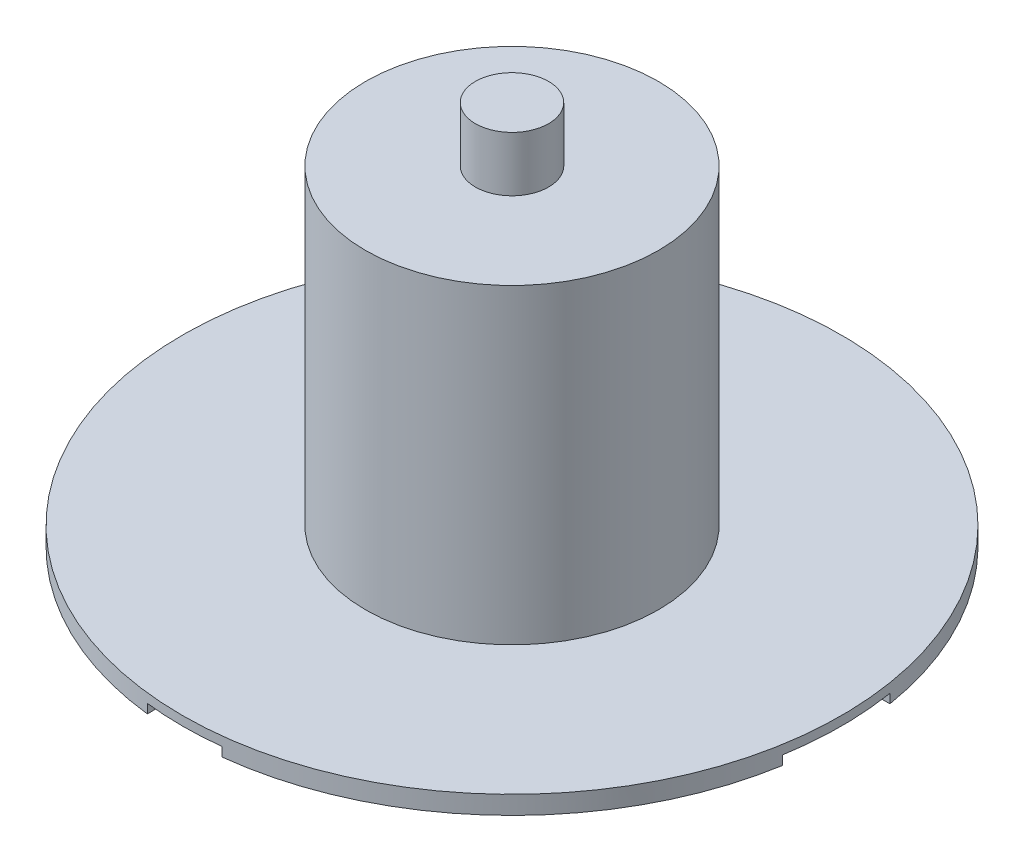
ISO-10303-21;
HEADER;
FILE_DESCRIPTION(('STEP AP214'),'2;1');
FILE_NAME('part.step','',(''),(''),'','','');
FILE_SCHEMA(('AUTOMOTIVE_DESIGN { 1 0 10303 214 1 1 1 1 }'));
ENDSEC;
DATA;
#1=APPLICATION_CONTEXT('core data for automotive mechanical design processes');
#2=APPLICATION_PROTOCOL_DEFINITION('international standard','automotive_design',2000,#1);
#3=PRODUCT_CONTEXT('',#1,'mechanical');
#4=PRODUCT('Part','Part','',(#3));
#5=PRODUCT_RELATED_PRODUCT_CATEGORY('part','',(#4));
#6=PRODUCT_DEFINITION_FORMATION('','',#4);
#7=PRODUCT_DEFINITION_CONTEXT('part definition',#1,'design');
#8=PRODUCT_DEFINITION('design','',#6,#7);
#9=PRODUCT_DEFINITION_SHAPE('','',#8);
#10=(LENGTH_UNIT() NAMED_UNIT(*) SI_UNIT(.MILLI.,.METRE.));
#11=(NAMED_UNIT(*) PLANE_ANGLE_UNIT() SI_UNIT($,.RADIAN.));
#12=(NAMED_UNIT(*) SI_UNIT($,.STERADIAN.) SOLID_ANGLE_UNIT());
#13=UNCERTAINTY_MEASURE_WITH_UNIT(LENGTH_MEASURE(1.E-05),#10,'distance_accuracy_value','');
#14=(GEOMETRIC_REPRESENTATION_CONTEXT(3) GLOBAL_UNCERTAINTY_ASSIGNED_CONTEXT((#13)) GLOBAL_UNIT_ASSIGNED_CONTEXT((#10,
#11,#12)) REPRESENTATION_CONTEXT('',''));
#15=CARTESIAN_POINT('',(0.,0.,0.));
#16=DIRECTION('',(0.,0.,1.));
#17=DIRECTION('',(1.,0.,0.));
#18=AXIS2_PLACEMENT_3D('',#15,#16,#17);
#19=CARTESIAN_POINT('',(0.,1.,0.));
#20=DIRECTION('',(0.,-1.,0.));
#21=DIRECTION('',(0.,0.,-1.));
#22=AXIS2_PLACEMENT_3D('',#19,#20,#21);
#23=CYLINDRICAL_SURFACE('',#22,18.);
#24=CARTESIAN_POINT('',(0.,1.,0.));
#25=DIRECTION('',(0.,1.,0.));
#26=DIRECTION('',(0.,0.,1.));
#27=AXIS2_PLACEMENT_3D('',#24,#25,#26);
#28=CIRCLE('',#27,18.);
#29=CARTESIAN_POINT('',(0.,1.,18.));
#30=VERTEX_POINT('',#29);
#31=EDGE_CURVE('E201',#30,#30,#28,.T.);
#32=ORIENTED_EDGE('',*,*,#31,.F.);
#33=EDGE_LOOP('',(#32));
#34=FACE_BOUND('',#33,.T.);
#35=DIRECTION('',(0.,-1.,0.));
#36=VECTOR('',#35,1.);
#37=CARTESIAN_POINT('',(17.7511123806519,0.5,2.98295310882812));
#38=LINE('',#37,#36);
#39=CARTESIAN_POINT('',(17.7511123806519,0.5,2.98295310882812));
#40=VERTEX_POINT('',#39);
#41=CARTESIAN_POINT('',(17.7511123806519,0.,2.98295310882812));
#42=VERTEX_POINT('',#41);
#43=EDGE_CURVE('E252',#40,#42,#38,.T.);
#44=ORIENTED_EDGE('',*,*,#43,.F.);
#45=CARTESIAN_POINT('',(0.,0.5,0.));
#46=DIRECTION('',(0.,-1.,0.));
#47=DIRECTION('',(0.,0.,-1.));
#48=AXIS2_PLACEMENT_3D('',#45,#46,#47);
#49=CIRCLE('',#48,18.);
#50=CARTESIAN_POINT('',(17.7686827637896,0.5,-2.87644100231601));
#51=VERTEX_POINT('',#50);
#52=EDGE_CURVE('E274',#51,#40,#49,.T.);
#53=ORIENTED_EDGE('',*,*,#52,.F.);
#54=DIRECTION('',(0.,-1.,0.));
#55=VECTOR('',#54,1.);
#56=CARTESIAN_POINT('',(17.7686827637896,0.5,-2.87644100231601));
#57=LINE('',#56,#55);
#58=CARTESIAN_POINT('',(17.7686827637896,0.,-2.87644100231601));
#59=VERTEX_POINT('',#58);
#60=EDGE_CURVE('E254',#51,#59,#57,.T.);
#61=ORIENTED_EDGE('',*,*,#60,.T.);
#62=CARTESIAN_POINT('',(0.,0.,0.));
#63=DIRECTION('',(0.,1.,0.));
#64=DIRECTION('',(0.,0.,1.));
#65=AXIS2_PLACEMENT_3D('',#62,#63,#64);
#66=CIRCLE('',#65,18.);
#67=CARTESIAN_POINT('',(2.035175879397,0.,-17.8845760123051));
#68=VERTEX_POINT('',#67);
#69=EDGE_CURVE('E205',#59,#68,#66,.T.);
#70=ORIENTED_EDGE('',*,*,#69,.T.);
#71=DIRECTION('',(0.,-1.,0.));
#72=VECTOR('',#71,1.);
#73=CARTESIAN_POINT('',(2.035175879397,0.5,-17.8845760123051));
#74=LINE('',#73,#72);
#75=CARTESIAN_POINT('',(2.035175879397,0.5,-17.8845760123051));
#76=VERTEX_POINT('',#75);
#77=EDGE_CURVE('E176',#76,#68,#74,.T.);
#78=ORIENTED_EDGE('',*,*,#77,.F.);
#79=CARTESIAN_POINT('',(0.,0.5,0.));
#80=DIRECTION('',(0.,-1.,0.));
#81=DIRECTION('',(0.,0.,-1.));
#82=AXIS2_PLACEMENT_3D('',#79,#80,#81);
#83=CIRCLE('',#82,18.);
#84=CARTESIAN_POINT('',(-2.03517587939699,0.5,-17.8845760123051));
#85=VERTEX_POINT('',#84);
#86=EDGE_CURVE('E166',#85,#76,#83,.T.);
#87=ORIENTED_EDGE('',*,*,#86,.F.);
#88=DIRECTION('',(0.,-1.,0.));
#89=VECTOR('',#88,1.);
#90=CARTESIAN_POINT('',(-2.03517587939699,0.5,-17.8845760123051));
#91=LINE('',#90,#89);
#92=CARTESIAN_POINT('',(-2.03517587939699,0.,-17.8845760123051));
#93=VERTEX_POINT('',#92);
#94=EDGE_CURVE('E165',#85,#93,#91,.T.);
#95=ORIENTED_EDGE('',*,*,#94,.T.);
#96=CARTESIAN_POINT('',(-17.7686827637896,0.,-2.87644100231601));
#97=VERTEX_POINT('',#96);
#98=EDGE_CURVE('E211',#93,#97,#66,.T.);
#99=ORIENTED_EDGE('',*,*,#98,.T.);
#100=DIRECTION('',(0.,-1.,0.));
#101=VECTOR('',#100,1.);
#102=CARTESIAN_POINT('',(-17.7686827637896,0.5,-2.87644100231601));
#103=LINE('',#102,#101);
#104=CARTESIAN_POINT('',(-17.7686827637896,0.5,-2.87644100231601));
#105=VERTEX_POINT('',#104);
#106=EDGE_CURVE('E220',#105,#97,#103,.T.);
#107=ORIENTED_EDGE('',*,*,#106,.F.);
#108=CARTESIAN_POINT('',(0.,0.5,0.));
#109=DIRECTION('',(0.,-1.,0.));
#110=DIRECTION('',(0.,0.,-1.));
#111=AXIS2_PLACEMENT_3D('',#108,#109,#110);
#112=CIRCLE('',#111,18.);
#113=CARTESIAN_POINT('',(-17.7511123806519,0.5,2.98295310882812));
#114=VERTEX_POINT('',#113);
#115=EDGE_CURVE('E178',#114,#105,#112,.T.);
#116=ORIENTED_EDGE('',*,*,#115,.F.);
#117=DIRECTION('',(0.,-1.,0.));
#118=VECTOR('',#117,1.);
#119=CARTESIAN_POINT('',(-17.7511123806519,0.5,2.98295310882812));
#120=LINE('',#119,#118);
#121=CARTESIAN_POINT('',(-17.7511123806519,0.,2.98295310882812));
#122=VERTEX_POINT('',#121);
#123=EDGE_CURVE('E236',#114,#122,#120,.T.);
#124=ORIENTED_EDGE('',*,*,#123,.T.);
#125=CARTESIAN_POINT('',(-2.035175879397,0.,17.8845760123051));
#126=VERTEX_POINT('',#125);
#127=EDGE_CURVE('E198',#122,#126,#66,.T.);
#128=ORIENTED_EDGE('',*,*,#127,.T.);
#129=DIRECTION('',(0.,-1.,0.));
#130=VECTOR('',#129,1.);
#131=CARTESIAN_POINT('',(-2.035175879397,0.5,17.8845760123051));
#132=LINE('',#131,#130);
#133=CARTESIAN_POINT('',(-2.035175879397,0.5,17.8845760123051));
#134=VERTEX_POINT('',#133);
#135=EDGE_CURVE('E243',#134,#126,#132,.T.);
#136=ORIENTED_EDGE('',*,*,#135,.F.);
#137=CARTESIAN_POINT('',(0.,0.5,0.));
#138=DIRECTION('',(0.,-1.,0.));
#139=DIRECTION('',(0.,0.,-1.));
#140=AXIS2_PLACEMENT_3D('',#137,#138,#139);
#141=CIRCLE('',#140,18.);
#142=CARTESIAN_POINT('',(2.03517587939699,0.5,17.8845760123051));
#143=VERTEX_POINT('',#142);
#144=EDGE_CURVE('E294',#143,#134,#141,.T.);
#145=ORIENTED_EDGE('',*,*,#144,.F.);
#146=DIRECTION('',(0.,-1.,0.));
#147=VECTOR('',#146,1.);
#148=CARTESIAN_POINT('',(2.03517587939699,0.5,17.8845760123051));
#149=LINE('',#148,#147);
#150=CARTESIAN_POINT('',(2.03517587939699,0.,17.8845760123051));
#151=VERTEX_POINT('',#150);
#152=EDGE_CURVE('E245',#143,#151,#149,.T.);
#153=ORIENTED_EDGE('',*,*,#152,.T.);
#154=EDGE_CURVE('E203',#151,#42,#66,.T.);
#155=ORIENTED_EDGE('',*,*,#154,.T.);
#156=EDGE_LOOP('',(#44,#53,#61,#70,#78,#87,#95,#99,#107,#116,#124,#128,#136,#145,#153,#155));
#157=FACE_BOUND('',#156,.T.);
#158=ADVANCED_FACE('F36',(#34,#157),#23,.T.);
#159=CARTESIAN_POINT('',(0.,0.,0.));
#160=DIRECTION('',(0.,1.,0.));
#161=DIRECTION('',(0.,0.,1.));
#162=AXIS2_PLACEMENT_3D('',#159,#160,#161);
#163=PLANE('',#162);
#164=DIRECTION('',(1.,0.,0.));
#165=VECTOR('',#164,1.);
#166=CARTESIAN_POINT('',(0.,0.,2.98295310882812));
#167=LINE('',#166,#165);
#168=CARTESIAN_POINT('',(-4.01272859168579,0.,2.98295310882812));
#169=VERTEX_POINT('',#168);
#170=EDGE_CURVE('E226',#122,#169,#167,.T.);
#171=ORIENTED_EDGE('',*,*,#170,.T.);
#172=CARTESIAN_POINT('',(0.,0.,0.));
#173=DIRECTION('',(0.,-1.,0.));
#174=DIRECTION('',(0.,0.,-1.));
#175=AXIS2_PLACEMENT_3D('',#172,#173,#174);
#176=CIRCLE('',#175,5.);
#177=CARTESIAN_POINT('',(-2.03517587939699,0.,4.56706241909618));
#178=VERTEX_POINT('',#177);
#179=EDGE_CURVE('E316',#178,#169,#176,.T.);
#180=ORIENTED_EDGE('',*,*,#179,.F.);
#181=DIRECTION('',(0.,0.,-1.));
#182=VECTOR('',#181,1.);
#183=CARTESIAN_POINT('',(-2.03517587939699,0.,0.));
#184=LINE('',#183,#182);
#185=EDGE_CURVE('E229',#126,#178,#184,.T.);
#186=ORIENTED_EDGE('',*,*,#185,.F.);
#187=ORIENTED_EDGE('',*,*,#127,.F.);
#188=EDGE_LOOP('',(#171,#180,#186,#187));
#189=FACE_BOUND('',#188,.T.);
#190=ADVANCED_FACE('F318',(#189),#163,.F.);
#191=DIRECTION('',(0.,0.,-1.));
#192=VECTOR('',#191,1.);
#193=CARTESIAN_POINT('',(2.03517587939699,0.,0.));
#194=LINE('',#193,#192);
#195=CARTESIAN_POINT('',(2.03517587939699,0.,4.56706241909618));
#196=VERTEX_POINT('',#195);
#197=EDGE_CURVE('E306',#151,#196,#194,.T.);
#198=ORIENTED_EDGE('',*,*,#197,.T.);
#199=CARTESIAN_POINT('',(4.01272859168579,0.,2.98295310882812));
#200=VERTEX_POINT('',#199);
#201=EDGE_CURVE('E189',#200,#196,#176,.T.);
#202=ORIENTED_EDGE('',*,*,#201,.F.);
#203=DIRECTION('',(1.,0.,0.));
#204=VECTOR('',#203,1.);
#205=CARTESIAN_POINT('',(0.,0.,2.98295310882812));
#206=LINE('',#205,#204);
#207=EDGE_CURVE('E303',#200,#42,#206,.T.);
#208=ORIENTED_EDGE('',*,*,#207,.T.);
#209=ORIENTED_EDGE('',*,*,#154,.F.);
#210=EDGE_LOOP('',(#198,#202,#208,#209));
#211=FACE_BOUND('',#210,.T.);
#212=ADVANCED_FACE('F323',(#211),#163,.F.);
#213=CARTESIAN_POINT('',(-4.08975392416161,0.,-2.87644100231601));
#214=VERTEX_POINT('',#213);
#215=CARTESIAN_POINT('',(-2.03517587939699,0.,-4.56706241909618));
#216=VERTEX_POINT('',#215);
#217=EDGE_CURVE('E174',#214,#216,#176,.T.);
#218=ORIENTED_EDGE('',*,*,#217,.F.);
#219=DIRECTION('',(1.,0.,0.));
#220=VECTOR('',#219,1.);
#221=CARTESIAN_POINT('',(0.,0.,-2.87644100231601));
#222=LINE('',#221,#220);
#223=EDGE_CURVE('E167',#97,#214,#222,.T.);
#224=ORIENTED_EDGE('',*,*,#223,.F.);
#225=ORIENTED_EDGE('',*,*,#98,.F.);
#226=DIRECTION('',(0.,0.,-1.));
#227=VECTOR('',#226,1.);
#228=CARTESIAN_POINT('',(-2.03517587939699,0.,0.));
#229=LINE('',#228,#227);
#230=EDGE_CURVE('E224',#216,#93,#229,.T.);
#231=ORIENTED_EDGE('',*,*,#230,.F.);
#232=EDGE_LOOP('',(#218,#224,#225,#231));
#233=FACE_BOUND('',#232,.T.);
#234=ADVANCED_FACE('F223',(#233),#163,.F.);
#235=ORIENTED_EDGE('',*,*,#69,.F.);
#236=DIRECTION('',(1.,0.,0.));
#237=VECTOR('',#236,1.);
#238=CARTESIAN_POINT('',(0.,0.,-2.87644100231601));
#239=LINE('',#238,#237);
#240=CARTESIAN_POINT('',(4.08975392416161,0.,-2.87644100231601));
#241=VERTEX_POINT('',#240);
#242=EDGE_CURVE('E270',#241,#59,#239,.T.);
#243=ORIENTED_EDGE('',*,*,#242,.F.);
#244=CARTESIAN_POINT('',(2.03517587939699,0.,-4.56706241909618));
#245=VERTEX_POINT('',#244);
#246=EDGE_CURVE('E186',#245,#241,#176,.T.);
#247=ORIENTED_EDGE('',*,*,#246,.F.);
#248=DIRECTION('',(0.,0.,-1.));
#249=VECTOR('',#248,1.);
#250=CARTESIAN_POINT('',(2.03517587939699,0.,0.));
#251=LINE('',#250,#249);
#252=EDGE_CURVE('E264',#245,#68,#251,.T.);
#253=ORIENTED_EDGE('',*,*,#252,.T.);
#254=EDGE_LOOP('',(#235,#243,#247,#253));
#255=FACE_BOUND('',#254,.T.);
#256=ADVANCED_FACE('F268',(#255),#163,.F.);
#257=CARTESIAN_POINT('',(0.,1.,0.));
#258=DIRECTION('',(0.,1.,0.));
#259=DIRECTION('',(0.,0.,1.));
#260=AXIS2_PLACEMENT_3D('',#257,#258,#259);
#261=PLANE('',#260);
#262=CARTESIAN_POINT('',(0.,1.,0.));
#263=DIRECTION('',(0.,1.,0.));
#264=DIRECTION('',(0.,0.,1.));
#265=AXIS2_PLACEMENT_3D('',#262,#263,#264);
#266=CIRCLE('',#265,8.);
#267=CARTESIAN_POINT('',(0.,1.,8.));
#268=VERTEX_POINT('',#267);
#269=EDGE_CURVE('E195',#268,#268,#266,.T.);
#270=ORIENTED_EDGE('',*,*,#269,.F.);
#271=EDGE_LOOP('',(#270));
#272=FACE_BOUND('',#271,.T.);
#273=ORIENTED_EDGE('',*,*,#31,.T.);
#274=EDGE_LOOP('',(#273));
#275=FACE_BOUND('',#274,.T.);
#276=ADVANCED_FACE('F351',(#272,#275),#261,.T.);
#277=CARTESIAN_POINT('',(0.,18.,0.));
#278=DIRECTION('',(0.,-1.,0.));
#279=DIRECTION('',(0.,0.,-1.));
#280=AXIS2_PLACEMENT_3D('',#277,#278,#279);
#281=CYLINDRICAL_SURFACE('',#280,8.);
#282=CARTESIAN_POINT('',(0.,18.,0.));
#283=DIRECTION('',(0.,1.,0.));
#284=DIRECTION('',(0.,0.,1.));
#285=AXIS2_PLACEMENT_3D('',#282,#283,#284);
#286=CIRCLE('',#285,8.);
#287=CARTESIAN_POINT('',(0.,18.,8.));
#288=VERTEX_POINT('',#287);
#289=EDGE_CURVE('E192',#288,#288,#286,.T.);
#290=ORIENTED_EDGE('',*,*,#289,.F.);
#291=EDGE_LOOP('',(#290));
#292=FACE_BOUND('',#291,.T.);
#293=ORIENTED_EDGE('',*,*,#269,.T.);
#294=EDGE_LOOP('',(#293));
#295=FACE_BOUND('',#294,.T.);
#296=ADVANCED_FACE('F353',(#292,#295),#281,.T.);
#297=CARTESIAN_POINT('',(0.,18.,0.));
#298=DIRECTION('',(0.,1.,0.));
#299=DIRECTION('',(0.,0.,1.));
#300=AXIS2_PLACEMENT_3D('',#297,#298,#299);
#301=PLANE('',#300);
#302=CARTESIAN_POINT('',(0.,18.,0.));
#303=DIRECTION('',(0.,1.,0.));
#304=DIRECTION('',(0.,0.,1.));
#305=AXIS2_PLACEMENT_3D('',#302,#303,#304);
#306=CIRCLE('',#305,2.);
#307=CARTESIAN_POINT('',(0.,18.,2.));
#308=VERTEX_POINT('',#307);
#309=EDGE_CURVE('E159',#308,#308,#306,.T.);
#310=ORIENTED_EDGE('',*,*,#309,.F.);
#311=EDGE_LOOP('',(#310));
#312=FACE_BOUND('',#311,.T.);
#313=ORIENTED_EDGE('',*,*,#289,.T.);
#314=EDGE_LOOP('',(#313));
#315=FACE_BOUND('',#314,.T.);
#316=ADVANCED_FACE('F360',(#312,#315),#301,.T.);
#317=CARTESIAN_POINT('',(0.,21.,0.));
#318=DIRECTION('',(0.,-1.,0.));
#319=DIRECTION('',(0.,0.,-1.));
#320=AXIS2_PLACEMENT_3D('',#317,#318,#319);
#321=CYLINDRICAL_SURFACE('',#320,2.);
#322=CARTESIAN_POINT('',(0.,21.,0.));
#323=DIRECTION('',(0.,1.,0.));
#324=DIRECTION('',(0.,0.,1.));
#325=AXIS2_PLACEMENT_3D('',#322,#323,#324);
#326=CIRCLE('',#325,2.);
#327=CARTESIAN_POINT('',(0.,21.,2.));
#328=VERTEX_POINT('',#327);
#329=EDGE_CURVE('E185',#328,#328,#326,.T.);
#330=ORIENTED_EDGE('',*,*,#329,.F.);
#331=EDGE_LOOP('',(#330));
#332=FACE_BOUND('',#331,.T.);
#333=ORIENTED_EDGE('',*,*,#309,.T.);
#334=EDGE_LOOP('',(#333));
#335=FACE_BOUND('',#334,.T.);
#336=ADVANCED_FACE('F367',(#332,#335),#321,.T.);
#337=CARTESIAN_POINT('',(0.,21.,0.));
#338=DIRECTION('',(0.,1.,0.));
#339=DIRECTION('',(0.,0.,1.));
#340=AXIS2_PLACEMENT_3D('',#337,#338,#339);
#341=PLANE('',#340);
#342=ORIENTED_EDGE('',*,*,#329,.T.);
#343=EDGE_LOOP('',(#342));
#344=FACE_BOUND('',#343,.T.);
#345=ADVANCED_FACE('F371',(#344),#341,.T.);
#346=CARTESIAN_POINT('',(0.,8.,0.));
#347=DIRECTION('',(0.,-1.,0.));
#348=DIRECTION('',(0.,0.,-1.));
#349=AXIS2_PLACEMENT_3D('',#346,#347,#348);
#350=CYLINDRICAL_SURFACE('',#349,5.);
#351=DIRECTION('',(0.,-1.,0.));
#352=VECTOR('',#351,1.);
#353=CARTESIAN_POINT('',(-2.03517587939699,0.5,-4.56706241909618));
#354=LINE('',#353,#352);
#355=CARTESIAN_POINT('',(-2.03517587939699,0.5,-4.56706241909618));
#356=VERTEX_POINT('',#355);
#357=EDGE_CURVE('E162',#356,#216,#354,.T.);
#358=ORIENTED_EDGE('',*,*,#357,.F.);
#359=CARTESIAN_POINT('',(0.,0.5,0.));
#360=DIRECTION('',(0.,-1.,0.));
#361=DIRECTION('',(0.,0.,-1.));
#362=AXIS2_PLACEMENT_3D('',#359,#360,#361);
#363=CIRCLE('',#362,5.);
#364=CARTESIAN_POINT('',(2.03517587939699,0.5,-4.56706241909618));
#365=VERTEX_POINT('',#364);
#366=EDGE_CURVE('E39',#365,#356,#363,.F.);
#367=ORIENTED_EDGE('',*,*,#366,.F.);
#368=DIRECTION('',(0.,-1.,0.));
#369=VECTOR('',#368,1.);
#370=CARTESIAN_POINT('',(2.03517587939699,0.5,-4.56706241909618));
#371=LINE('',#370,#369);
#372=EDGE_CURVE('E259',#365,#245,#371,.T.);
#373=ORIENTED_EDGE('',*,*,#372,.T.);
#374=ORIENTED_EDGE('',*,*,#246,.T.);
#375=DIRECTION('',(0.,-1.,0.));
#376=VECTOR('',#375,1.);
#377=CARTESIAN_POINT('',(4.08975392416161,0.5,-2.87644100231601));
#378=LINE('',#377,#376);
#379=CARTESIAN_POINT('',(4.08975392416161,0.5,-2.87644100231601));
#380=VERTEX_POINT('',#379);
#381=EDGE_CURVE('E257',#380,#241,#378,.T.);
#382=ORIENTED_EDGE('',*,*,#381,.F.);
#383=CARTESIAN_POINT('',(4.01272859168579,0.5,2.98295310882812));
#384=VERTEX_POINT('',#383);
#385=EDGE_CURVE('E158',#384,#380,#363,.F.);
#386=ORIENTED_EDGE('',*,*,#385,.F.);
#387=DIRECTION('',(0.,-1.,0.));
#388=VECTOR('',#387,1.);
#389=CARTESIAN_POINT('',(4.01272859168579,0.5,2.98295310882812));
#390=LINE('',#389,#388);
#391=EDGE_CURVE('E249',#384,#200,#390,.T.);
#392=ORIENTED_EDGE('',*,*,#391,.T.);
#393=ORIENTED_EDGE('',*,*,#201,.T.);
#394=DIRECTION('',(0.,-1.,0.));
#395=VECTOR('',#394,1.);
#396=CARTESIAN_POINT('',(2.03517587939699,0.5,4.56706241909618));
#397=LINE('',#396,#395);
#398=CARTESIAN_POINT('',(2.03517587939699,0.5,4.56706241909618));
#399=VERTEX_POINT('',#398);
#400=EDGE_CURVE('E247',#399,#196,#397,.T.);
#401=ORIENTED_EDGE('',*,*,#400,.F.);
#402=CARTESIAN_POINT('',(-2.03517587939699,0.5,4.56706241909618));
#403=VERTEX_POINT('',#402);
#404=EDGE_CURVE('E44',#403,#399,#363,.F.);
#405=ORIENTED_EDGE('',*,*,#404,.F.);
#406=DIRECTION('',(0.,-1.,0.));
#407=VECTOR('',#406,1.);
#408=CARTESIAN_POINT('',(-2.03517587939699,0.5,4.56706241909618));
#409=LINE('',#408,#407);
#410=EDGE_CURVE('E240',#403,#178,#409,.T.);
#411=ORIENTED_EDGE('',*,*,#410,.T.);
#412=ORIENTED_EDGE('',*,*,#179,.T.);
#413=DIRECTION('',(0.,-1.,0.));
#414=VECTOR('',#413,1.);
#415=CARTESIAN_POINT('',(-4.01272859168579,0.5,2.98295310882812));
#416=LINE('',#415,#414);
#417=CARTESIAN_POINT('',(-4.01272859168579,0.5,2.98295310882812));
#418=VERTEX_POINT('',#417);
#419=EDGE_CURVE('E238',#418,#169,#416,.T.);
#420=ORIENTED_EDGE('',*,*,#419,.F.);
#421=CARTESIAN_POINT('',(-4.08975392416161,0.5,-2.87644100231601));
#422=VERTEX_POINT('',#421);
#423=EDGE_CURVE('E11',#422,#418,#363,.F.);
#424=ORIENTED_EDGE('',*,*,#423,.F.);
#425=DIRECTION('',(0.,-1.,0.));
#426=VECTOR('',#425,1.);
#427=CARTESIAN_POINT('',(-4.08975392416161,0.5,-2.87644100231601));
#428=LINE('',#427,#426);
#429=EDGE_CURVE('E233',#422,#214,#428,.T.);
#430=ORIENTED_EDGE('',*,*,#429,.T.);
#431=ORIENTED_EDGE('',*,*,#217,.T.);
#432=EDGE_LOOP('',(#358,#367,#373,#374,#382,#386,#392,#393,#401,#405,#411,#412,#420,#424,#430,#431));
#433=FACE_BOUND('',#432,.T.);
#434=CARTESIAN_POINT('',(0.,8.,0.));
#435=DIRECTION('',(0.,-1.,0.));
#436=DIRECTION('',(0.,0.,-1.));
#437=AXIS2_PLACEMENT_3D('',#434,#435,#436);
#438=CIRCLE('',#437,5.);
#439=CARTESIAN_POINT('',(0.,8.,-5.));
#440=VERTEX_POINT('',#439);
#441=EDGE_CURVE('E182',#440,#440,#438,.T.);
#442=ORIENTED_EDGE('',*,*,#441,.F.);
#443=EDGE_LOOP('',(#442));
#444=FACE_BOUND('',#443,.T.);
#445=ADVANCED_FACE('F170',(#433,#444),#350,.F.);
#446=CARTESIAN_POINT('',(0.,8.,0.));
#447=DIRECTION('',(0.,-1.,0.));
#448=DIRECTION('',(0.,0.,-1.));
#449=AXIS2_PLACEMENT_3D('',#446,#447,#448);
#450=PLANE('',#449);
#451=ORIENTED_EDGE('',*,*,#441,.T.);
#452=EDGE_LOOP('',(#451));
#453=FACE_BOUND('',#452,.T.);
#454=ADVANCED_FACE('F378',(#453),#450,.T.);
#455=CARTESIAN_POINT('',(0.,0.5,0.));
#456=DIRECTION('',(0.,-1.,0.));
#457=DIRECTION('',(0.,0.,-1.));
#458=AXIS2_PLACEMENT_3D('',#455,#456,#457);
#459=PLANE('',#458);
#460=ORIENTED_EDGE('',*,*,#366,.T.);
#461=DIRECTION('',(0.,0.,-1.));
#462=VECTOR('',#461,1.);
#463=CARTESIAN_POINT('',(-2.03517587939699,0.5,0.));
#464=LINE('',#463,#462);
#465=EDGE_CURVE('E151',#356,#85,#464,.T.);
#466=ORIENTED_EDGE('',*,*,#465,.T.);
#467=ORIENTED_EDGE('',*,*,#86,.T.);
#468=DIRECTION('',(0.,0.,-1.));
#469=VECTOR('',#468,1.);
#470=CARTESIAN_POINT('',(2.03517587939699,0.5,0.));
#471=LINE('',#470,#469);
#472=EDGE_CURVE('E153',#365,#76,#471,.T.);
#473=ORIENTED_EDGE('',*,*,#472,.F.);
#474=EDGE_LOOP('',(#460,#466,#467,#473));
#475=FACE_BOUND('',#474,.T.);
#476=ADVANCED_FACE('F149',(#475),#459,.T.);
#477=CARTESIAN_POINT('',(-2.03517587939699,0.5,0.));
#478=DIRECTION('',(-1.,0.,0.));
#479=DIRECTION('',(0.,0.,1.));
#480=AXIS2_PLACEMENT_3D('',#477,#478,#479);
#481=PLANE('',#480);
#482=ORIENTED_EDGE('',*,*,#230,.T.);
#483=ORIENTED_EDGE('',*,*,#94,.F.);
#484=ORIENTED_EDGE('',*,*,#465,.F.);
#485=ORIENTED_EDGE('',*,*,#357,.T.);
#486=EDGE_LOOP('',(#482,#483,#484,#485));
#487=FACE_BOUND('',#486,.T.);
#488=ADVANCED_FACE('F161',(#487),#481,.F.);
#489=CARTESIAN_POINT('',(2.03517587939699,0.5,0.));
#490=DIRECTION('',(-1.,0.,0.));
#491=DIRECTION('',(0.,0.,1.));
#492=AXIS2_PLACEMENT_3D('',#489,#490,#491);
#493=PLANE('',#492);
#494=ORIENTED_EDGE('',*,*,#252,.F.);
#495=ORIENTED_EDGE('',*,*,#372,.F.);
#496=ORIENTED_EDGE('',*,*,#472,.T.);
#497=ORIENTED_EDGE('',*,*,#77,.T.);
#498=EDGE_LOOP('',(#494,#495,#496,#497));
#499=FACE_BOUND('',#498,.T.);
#500=ADVANCED_FACE('F263',(#499),#493,.T.);
#501=ORIENTED_EDGE('',*,*,#385,.T.);
#502=DIRECTION('',(1.,0.,0.));
#503=VECTOR('',#502,1.);
#504=CARTESIAN_POINT('',(0.,0.5,-2.87644100231601));
#505=LINE('',#504,#503);
#506=EDGE_CURVE('E279',#380,#51,#505,.T.);
#507=ORIENTED_EDGE('',*,*,#506,.T.);
#508=ORIENTED_EDGE('',*,*,#52,.T.);
#509=DIRECTION('',(1.,0.,0.));
#510=VECTOR('',#509,1.);
#511=CARTESIAN_POINT('',(0.,0.5,2.98295310882812));
#512=LINE('',#511,#510);
#513=EDGE_CURVE('E285',#384,#40,#512,.T.);
#514=ORIENTED_EDGE('',*,*,#513,.F.);
#515=EDGE_LOOP('',(#501,#507,#508,#514));
#516=FACE_BOUND('',#515,.T.);
#517=ADVANCED_FACE('F282',(#516),#459,.T.);
#518=CARTESIAN_POINT('',(0.,0.5,-2.87644100231601));
#519=DIRECTION('',(0.,0.,-1.));
#520=DIRECTION('',(-1.,0.,0.));
#521=AXIS2_PLACEMENT_3D('',#518,#519,#520);
#522=PLANE('',#521);
#523=ORIENTED_EDGE('',*,*,#242,.T.);
#524=ORIENTED_EDGE('',*,*,#60,.F.);
#525=ORIENTED_EDGE('',*,*,#506,.F.);
#526=ORIENTED_EDGE('',*,*,#381,.T.);
#527=EDGE_LOOP('',(#523,#524,#525,#526));
#528=FACE_BOUND('',#527,.T.);
#529=ADVANCED_FACE('F278',(#528),#522,.F.);
#530=CARTESIAN_POINT('',(0.,0.5,2.98295310882812));
#531=DIRECTION('',(0.,0.,-1.));
#532=DIRECTION('',(-1.,0.,0.));
#533=AXIS2_PLACEMENT_3D('',#530,#531,#532);
#534=PLANE('',#533);
#535=ORIENTED_EDGE('',*,*,#207,.F.);
#536=ORIENTED_EDGE('',*,*,#391,.F.);
#537=ORIENTED_EDGE('',*,*,#513,.T.);
#538=ORIENTED_EDGE('',*,*,#43,.T.);
#539=EDGE_LOOP('',(#535,#536,#537,#538));
#540=FACE_BOUND('',#539,.T.);
#541=ADVANCED_FACE('F330',(#540),#534,.T.);
#542=ORIENTED_EDGE('',*,*,#404,.T.);
#543=DIRECTION('',(0.,0.,-1.));
#544=VECTOR('',#543,1.);
#545=CARTESIAN_POINT('',(2.03517587939699,0.5,0.));
#546=LINE('',#545,#544);
#547=EDGE_CURVE('E291',#143,#399,#546,.T.);
#548=ORIENTED_EDGE('',*,*,#547,.F.);
#549=ORIENTED_EDGE('',*,*,#144,.T.);
#550=DIRECTION('',(0.,0.,-1.));
#551=VECTOR('',#550,1.);
#552=CARTESIAN_POINT('',(-2.03517587939699,0.5,0.));
#553=LINE('',#552,#551);
#554=EDGE_CURVE('E58',#134,#403,#553,.T.);
#555=ORIENTED_EDGE('',*,*,#554,.T.);
#556=EDGE_LOOP('',(#542,#548,#549,#555));
#557=FACE_BOUND('',#556,.T.);
#558=ADVANCED_FACE('F328',(#557),#459,.T.);
#559=CARTESIAN_POINT('',(2.03517587939699,0.5,0.));
#560=DIRECTION('',(-1.,0.,0.));
#561=DIRECTION('',(0.,0.,1.));
#562=AXIS2_PLACEMENT_3D('',#559,#560,#561);
#563=PLANE('',#562);
#564=ORIENTED_EDGE('',*,*,#197,.F.);
#565=ORIENTED_EDGE('',*,*,#152,.F.);
#566=ORIENTED_EDGE('',*,*,#547,.T.);
#567=ORIENTED_EDGE('',*,*,#400,.T.);
#568=EDGE_LOOP('',(#564,#565,#566,#567));
#569=FACE_BOUND('',#568,.T.);
#570=ADVANCED_FACE('F325',(#569),#563,.T.);
#571=CARTESIAN_POINT('',(-2.03517587939699,0.5,0.));
#572=DIRECTION('',(-1.,0.,0.));
#573=DIRECTION('',(0.,0.,1.));
#574=AXIS2_PLACEMENT_3D('',#571,#572,#573);
#575=PLANE('',#574);
#576=ORIENTED_EDGE('',*,*,#185,.T.);
#577=ORIENTED_EDGE('',*,*,#410,.F.);
#578=ORIENTED_EDGE('',*,*,#554,.F.);
#579=ORIENTED_EDGE('',*,*,#135,.T.);
#580=EDGE_LOOP('',(#576,#577,#578,#579));
#581=FACE_BOUND('',#580,.T.);
#582=ADVANCED_FACE('F310',(#581),#575,.F.);
#583=ORIENTED_EDGE('',*,*,#423,.T.);
#584=DIRECTION('',(1.,0.,0.));
#585=VECTOR('',#584,1.);
#586=CARTESIAN_POINT('',(0.,0.5,2.98295310882812));
#587=LINE('',#586,#585);
#588=EDGE_CURVE('E297',#114,#418,#587,.T.);
#589=ORIENTED_EDGE('',*,*,#588,.F.);
#590=ORIENTED_EDGE('',*,*,#115,.T.);
#591=DIRECTION('',(1.,0.,0.));
#592=VECTOR('',#591,1.);
#593=CARTESIAN_POINT('',(0.,0.5,-2.87644100231601));
#594=LINE('',#593,#592);
#595=EDGE_CURVE('E50',#105,#422,#594,.T.);
#596=ORIENTED_EDGE('',*,*,#595,.T.);
#597=EDGE_LOOP('',(#583,#589,#590,#596));
#598=FACE_BOUND('',#597,.T.);
#599=ADVANCED_FACE('F332',(#598),#459,.T.);
#600=CARTESIAN_POINT('',(0.,0.5,-2.87644100231601));
#601=DIRECTION('',(0.,0.,-1.));
#602=DIRECTION('',(-1.,0.,0.));
#603=AXIS2_PLACEMENT_3D('',#600,#601,#602);
#604=PLANE('',#603);
#605=ORIENTED_EDGE('',*,*,#223,.T.);
#606=ORIENTED_EDGE('',*,*,#429,.F.);
#607=ORIENTED_EDGE('',*,*,#595,.F.);
#608=ORIENTED_EDGE('',*,*,#106,.T.);
#609=EDGE_LOOP('',(#605,#606,#607,#608));
#610=FACE_BOUND('',#609,.T.);
#611=ADVANCED_FACE('F343',(#610),#604,.F.);
#612=CARTESIAN_POINT('',(0.,0.5,2.98295310882812));
#613=DIRECTION('',(0.,0.,-1.));
#614=DIRECTION('',(-1.,0.,0.));
#615=AXIS2_PLACEMENT_3D('',#612,#613,#614);
#616=PLANE('',#615);
#617=ORIENTED_EDGE('',*,*,#170,.F.);
#618=ORIENTED_EDGE('',*,*,#123,.F.);
#619=ORIENTED_EDGE('',*,*,#588,.T.);
#620=ORIENTED_EDGE('',*,*,#419,.T.);
#621=EDGE_LOOP('',(#617,#618,#619,#620));
#622=FACE_BOUND('',#621,.T.);
#623=ADVANCED_FACE('F390',(#622),#616,.T.);
#624=CLOSED_SHELL('',(#158,#190,#212,#234,#256,#276,#296,#316,#336,#345,#445,#454,#476,#488,
#500,#517,#529,#541,#558,#570,#582,#599,#611,#623));
#625=MANIFOLD_SOLID_BREP('B2',#624);
#626=ADVANCED_BREP_SHAPE_REPRESENTATION('',(#18,#625),#14);
#627=SHAPE_DEFINITION_REPRESENTATION(#9,#626);
ENDSEC;
END-ISO-10303-21;
